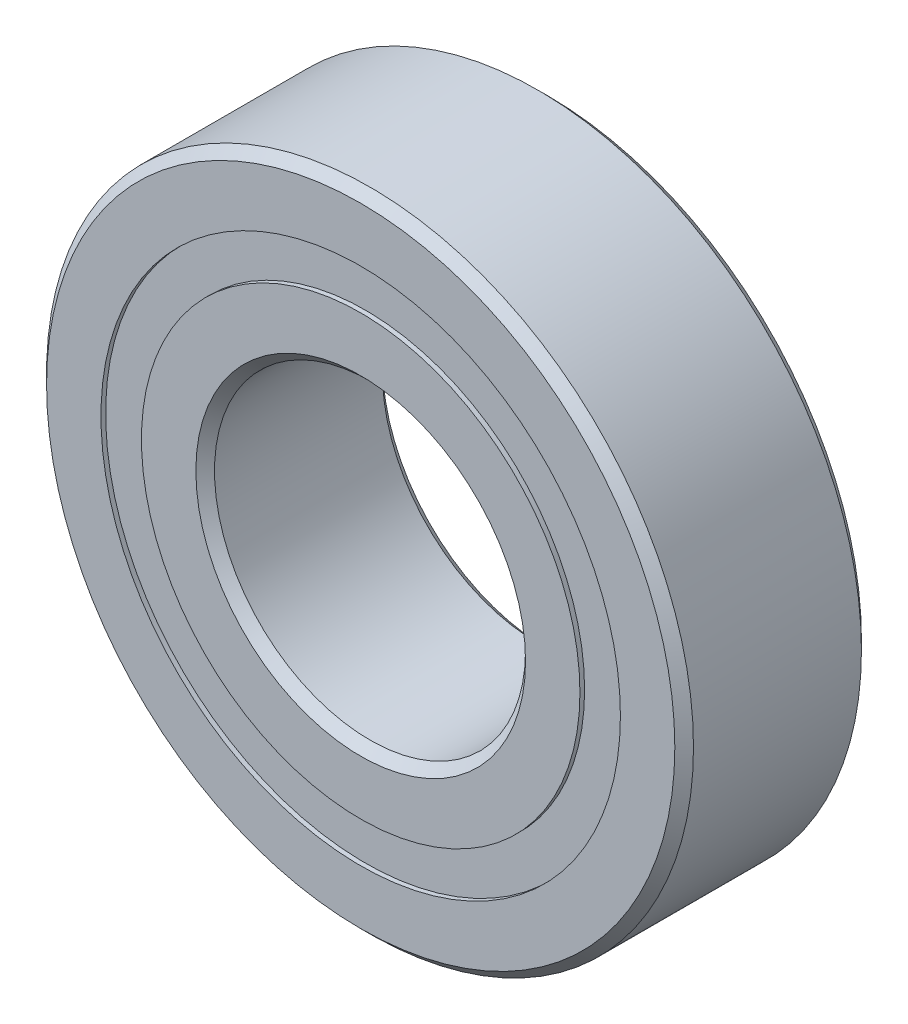
ISO-10303-21;
HEADER;
FILE_DESCRIPTION(('STEP AP214'),'2;1');
FILE_NAME('part.step','',(''),(''),'','','');
FILE_SCHEMA(('AUTOMOTIVE_DESIGN { 1 0 10303 214 1 1 1 1 }'));
ENDSEC;
DATA;
#1=APPLICATION_CONTEXT('core data for automotive mechanical design processes');
#2=APPLICATION_PROTOCOL_DEFINITION('international standard','automotive_design',2000,#1);
#3=PRODUCT_CONTEXT('',#1,'mechanical');
#4=PRODUCT('Part','Part','',(#3));
#5=PRODUCT_RELATED_PRODUCT_CATEGORY('part','',(#4));
#6=PRODUCT_DEFINITION_FORMATION('','',#4);
#7=PRODUCT_DEFINITION_CONTEXT('part definition',#1,'design');
#8=PRODUCT_DEFINITION('design','',#6,#7);
#9=PRODUCT_DEFINITION_SHAPE('','',#8);
#10=(LENGTH_UNIT() NAMED_UNIT(*) SI_UNIT(.MILLI.,.METRE.));
#11=(NAMED_UNIT(*) PLANE_ANGLE_UNIT() SI_UNIT($,.RADIAN.));
#12=(NAMED_UNIT(*) SI_UNIT($,.STERADIAN.) SOLID_ANGLE_UNIT());
#13=UNCERTAINTY_MEASURE_WITH_UNIT(LENGTH_MEASURE(1.E-05),#10,'distance_accuracy_value','');
#14=(GEOMETRIC_REPRESENTATION_CONTEXT(3) GLOBAL_UNCERTAINTY_ASSIGNED_CONTEXT((#13)) GLOBAL_UNIT_ASSIGNED_CONTEXT((#10,
#11,#12)) REPRESENTATION_CONTEXT('',''));
#15=CARTESIAN_POINT('',(0.,0.,0.));
#16=DIRECTION('',(0.,0.,1.));
#17=DIRECTION('',(1.,0.,0.));
#18=AXIS2_PLACEMENT_3D('',#15,#16,#17);
#19=CARTESIAN_POINT('',(0.,20.8763736263736,-7.12500000000001));
#20=DIRECTION('',(0.,0.,1.));
#21=DIRECTION('',(1.,0.,0.));
#22=AXIS2_PLACEMENT_3D('',#19,#20,#21);
#23=PLANE('',#22);
#24=CARTESIAN_POINT('',(0.,0.,-7.12500000000001));
#25=DIRECTION('',(0.,0.,1.));
#26=DIRECTION('',(1.,0.,0.));
#27=AXIS2_PLACEMENT_3D('',#24,#25,#26);
#28=CIRCLE('',#27,20.8763736263736);
#29=CARTESIAN_POINT('',(20.8763736263736,0.,-7.12500000000001));
#30=VERTEX_POINT('',#29);
#31=EDGE_CURVE('E55',#30,#30,#28,.T.);
#32=ORIENTED_EDGE('',*,*,#31,.F.);
#33=EDGE_LOOP('',(#32));
#34=FACE_BOUND('',#33,.T.);
#35=CARTESIAN_POINT('',(0.,0.,-7.12500000000001));
#36=DIRECTION('',(0.,0.,1.));
#37=DIRECTION('',(1.,0.,0.));
#38=AXIS2_PLACEMENT_3D('',#35,#36,#37);
#39=CIRCLE('',#38,17.6236263736264);
#40=CARTESIAN_POINT('',(17.6236263736264,0.,-7.12500000000001));
#41=VERTEX_POINT('',#40);
#42=EDGE_CURVE('E11',#41,#41,#39,.T.);
#43=ORIENTED_EDGE('',*,*,#42,.T.);
#44=EDGE_LOOP('',(#43));
#45=FACE_BOUND('',#44,.T.);
#46=ADVANCED_FACE('F41',(#34,#45),#23,.F.);
#47=CARTESIAN_POINT('',(0.,0.,7.5));
#48=DIRECTION('',(0.,0.,1.));
#49=DIRECTION('',(1.,0.,0.));
#50=AXIS2_PLACEMENT_3D('',#47,#48,#49);
#51=CYLINDRICAL_SURFACE('',#50,17.6236263736264);
#52=ORIENTED_EDGE('',*,*,#42,.F.);
#53=EDGE_LOOP('',(#52));
#54=FACE_BOUND('',#53,.T.);
#55=CARTESIAN_POINT('',(0.,0.,-3.70893546501888));
#56=DIRECTION('',(0.,0.,1.));
#57=DIRECTION('',(1.,0.,0.));
#58=AXIS2_PLACEMENT_3D('',#55,#56,#57);
#59=CIRCLE('',#58,17.6236263736264);
#60=CARTESIAN_POINT('',(17.6236263736264,0.,-3.70893546501888));
#61=VERTEX_POINT('',#60);
#62=EDGE_CURVE('E47',#61,#61,#59,.T.);
#63=ORIENTED_EDGE('',*,*,#62,.T.);
#64=EDGE_LOOP('',(#63));
#65=FACE_BOUND('',#64,.T.);
#66=ADVANCED_FACE('F64',(#54,#65),#51,.F.);
#67=CARTESIAN_POINT('',(0.,20.8763736263736,-3.70893546501888));
#68=DIRECTION('',(0.,0.,-1.));
#69=DIRECTION('',(-1.,0.,0.));
#70=AXIS2_PLACEMENT_3D('',#67,#68,#69);
#71=PLANE('',#70);
#72=ORIENTED_EDGE('',*,*,#62,.F.);
#73=EDGE_LOOP('',(#72));
#74=FACE_BOUND('',#73,.T.);
#75=CARTESIAN_POINT('',(0.,0.,-3.70893546501888));
#76=DIRECTION('',(0.,0.,1.));
#77=DIRECTION('',(1.,0.,0.));
#78=AXIS2_PLACEMENT_3D('',#75,#76,#77);
#79=CIRCLE('',#78,20.8763736263736);
#80=CARTESIAN_POINT('',(20.8763736263736,0.,-3.70893546501888));
#81=VERTEX_POINT('',#80);
#82=EDGE_CURVE('E51',#81,#81,#79,.T.);
#83=ORIENTED_EDGE('',*,*,#82,.T.);
#84=EDGE_LOOP('',(#83));
#85=FACE_BOUND('',#84,.T.);
#86=ADVANCED_FACE('F68',(#74,#85),#71,.F.);
#87=CARTESIAN_POINT('',(0.,0.,7.5));
#88=DIRECTION('',(0.,0.,1.));
#89=DIRECTION('',(1.,0.,0.));
#90=AXIS2_PLACEMENT_3D('',#87,#88,#89);
#91=CYLINDRICAL_SURFACE('',#90,20.8763736263736);
#92=ORIENTED_EDGE('',*,*,#82,.F.);
#93=EDGE_LOOP('',(#92));
#94=FACE_BOUND('',#93,.T.);
#95=ORIENTED_EDGE('',*,*,#31,.T.);
#96=EDGE_LOOP('',(#95));
#97=FACE_BOUND('',#96,.T.);
#98=ADVANCED_FACE('F61',(#94,#97),#91,.T.);
#99=CLOSED_SHELL('',(#46,#66,#86,#98));
#100=MANIFOLD_SOLID_BREP('B2',#99);
#101=CARTESIAN_POINT('',(0.,20.8763736263736,7.125));
#102=DIRECTION('',(0.,0.,-1.));
#103=DIRECTION('',(-1.,0.,0.));
#104=AXIS2_PLACEMENT_3D('',#101,#102,#103);
#105=PLANE('',#104);
#106=CARTESIAN_POINT('',(0.,0.,7.125));
#107=DIRECTION('',(0.,0.,1.));
#108=DIRECTION('',(1.,0.,0.));
#109=AXIS2_PLACEMENT_3D('',#106,#107,#108);
#110=CIRCLE('',#109,17.6236263736264);
#111=CARTESIAN_POINT('',(17.6236263736264,0.,7.125));
#112=VERTEX_POINT('',#111);
#113=EDGE_CURVE('E40',#112,#112,#110,.T.);
#114=ORIENTED_EDGE('',*,*,#113,.F.);
#115=EDGE_LOOP('',(#114));
#116=FACE_BOUND('',#115,.T.);
#117=CARTESIAN_POINT('',(0.,0.,7.125));
#118=DIRECTION('',(0.,0.,1.));
#119=DIRECTION('',(1.,0.,0.));
#120=AXIS2_PLACEMENT_3D('',#117,#118,#119);
#121=CIRCLE('',#120,20.8763736263736);
#122=CARTESIAN_POINT('',(20.8763736263736,0.,7.125));
#123=VERTEX_POINT('',#122);
#124=EDGE_CURVE('E122',#123,#123,#121,.T.);
#125=ORIENTED_EDGE('',*,*,#124,.T.);
#126=EDGE_LOOP('',(#125));
#127=FACE_BOUND('',#126,.T.);
#128=ADVANCED_FACE('F108',(#116,#127),#105,.F.);
#129=CARTESIAN_POINT('',(0.,0.,7.5));
#130=DIRECTION('',(0.,0.,1.));
#131=DIRECTION('',(1.,0.,0.));
#132=AXIS2_PLACEMENT_3D('',#129,#130,#131);
#133=CYLINDRICAL_SURFACE('',#132,17.6236263736264);
#134=CARTESIAN_POINT('',(0.,0.,3.70893546501888));
#135=DIRECTION('',(0.,0.,1.));
#136=DIRECTION('',(1.,0.,0.));
#137=AXIS2_PLACEMENT_3D('',#134,#135,#136);
#138=CIRCLE('',#137,17.6236263736264);
#139=CARTESIAN_POINT('',(17.6236263736264,0.,3.70893546501888));
#140=VERTEX_POINT('',#139);
#141=EDGE_CURVE('E114',#140,#140,#138,.T.);
#142=ORIENTED_EDGE('',*,*,#141,.F.);
#143=EDGE_LOOP('',(#142));
#144=FACE_BOUND('',#143,.T.);
#145=ORIENTED_EDGE('',*,*,#113,.T.);
#146=EDGE_LOOP('',(#145));
#147=FACE_BOUND('',#146,.T.);
#148=ADVANCED_FACE('F137',(#144,#147),#133,.F.);
#149=CARTESIAN_POINT('',(0.,20.8763736263736,3.70893546501888));
#150=DIRECTION('',(0.,0.,1.));
#151=DIRECTION('',(1.,0.,0.));
#152=AXIS2_PLACEMENT_3D('',#149,#150,#151);
#153=PLANE('',#152);
#154=CARTESIAN_POINT('',(0.,0.,3.70893546501888));
#155=DIRECTION('',(0.,0.,1.));
#156=DIRECTION('',(1.,0.,0.));
#157=AXIS2_PLACEMENT_3D('',#154,#155,#156);
#158=CIRCLE('',#157,20.8763736263736);
#159=CARTESIAN_POINT('',(20.8763736263736,0.,3.70893546501888));
#160=VERTEX_POINT('',#159);
#161=EDGE_CURVE('E118',#160,#160,#158,.T.);
#162=ORIENTED_EDGE('',*,*,#161,.F.);
#163=EDGE_LOOP('',(#162));
#164=FACE_BOUND('',#163,.T.);
#165=ORIENTED_EDGE('',*,*,#141,.T.);
#166=EDGE_LOOP('',(#165));
#167=FACE_BOUND('',#166,.T.);
#168=ADVANCED_FACE('F132',(#164,#167),#153,.F.);
#169=CARTESIAN_POINT('',(0.,0.,7.5));
#170=DIRECTION('',(0.,0.,1.));
#171=DIRECTION('',(1.,0.,0.));
#172=AXIS2_PLACEMENT_3D('',#169,#170,#171);
#173=CYLINDRICAL_SURFACE('',#172,20.8763736263736);
#174=ORIENTED_EDGE('',*,*,#124,.F.);
#175=EDGE_LOOP('',(#174));
#176=FACE_BOUND('',#175,.T.);
#177=ORIENTED_EDGE('',*,*,#161,.T.);
#178=EDGE_LOOP('',(#177));
#179=FACE_BOUND('',#178,.T.);
#180=ADVANCED_FACE('F129',(#176,#179),#173,.T.);
#181=CLOSED_SHELL('',(#128,#148,#168,#180));
#182=MANIFOLD_SOLID_BREP('B6',#181);
#183=CARTESIAN_POINT('',(-9.62499999999979,16.6709890228506,0.));
#184=DIRECTION('',(0.,0.,1.));
#185=DIRECTION('',(-0.499999999999989,0.866025403784445,0.));
#186=AXIS2_PLACEMENT_3D('',#183,#184,#185);
#187=SPHERICAL_SURFACE('',#186,3.70893546501888);
#188=CARTESIAN_POINT('',(-9.62499999999979,16.6709890228506,3.70893546501888));
#189=VERTEX_POINT('',#188);
#190=VERTEX_LOOP('',#189);
#191=FACE_BOUND('',#190,.T.);
#192=ADVANCED_FACE('F175',(#191),#187,.T.);
#193=CLOSED_SHELL('',(#192));
#194=MANIFOLD_SOLID_BREP('B35',#193);
#195=CARTESIAN_POINT('',(-16.6709890228503,9.62500000000019,0.));
#196=DIRECTION('',(0.,0.,1.));
#197=DIRECTION('',(-0.866025403784433,0.50000000000001,0.));
#198=AXIS2_PLACEMENT_3D('',#195,#196,#197);
#199=SPHERICAL_SURFACE('',#198,3.70893546501888);
#200=CARTESIAN_POINT('',(-16.6709890228503,9.62500000000019,3.70893546501888));
#201=VERTEX_POINT('',#200);
#202=VERTEX_LOOP('',#201);
#203=FACE_BOUND('',#202,.T.);
#204=ADVANCED_FACE('F195',(#203),#199,.T.);
#205=CLOSED_SHELL('',(#204));
#206=MANIFOLD_SOLID_BREP('B104',#205);
#207=CARTESIAN_POINT('',(-19.25,2.01633047318191E-13,0.));
#208=DIRECTION('',(0.,0.,1.));
#209=DIRECTION('',(-1.,0.,0.));
#210=AXIS2_PLACEMENT_3D('',#207,#208,#209);
#211=SPHERICAL_SURFACE('',#210,3.70893546501888);
#212=CARTESIAN_POINT('',(-19.25,2.01633047318191E-13,3.70893546501888));
#213=VERTEX_POINT('',#212);
#214=VERTEX_LOOP('',#213);
#215=FACE_BOUND('',#214,.T.);
#216=ADVANCED_FACE('F215',(#215),#211,.T.);
#217=CLOSED_SHELL('',(#216));
#218=MANIFOLD_SOLID_BREP('B171',#217);
#219=CARTESIAN_POINT('',(-16.6709890228505,-9.62499999999985,0.));
#220=DIRECTION('',(0.,0.,1.));
#221=DIRECTION('',(-0.866025403784443,-0.499999999999992,0.));
#222=AXIS2_PLACEMENT_3D('',#219,#220,#221);
#223=SPHERICAL_SURFACE('',#222,3.70893546501888);
#224=CARTESIAN_POINT('',(-16.6709890228505,-9.62499999999985,3.70893546501888));
#225=VERTEX_POINT('',#224);
#226=VERTEX_LOOP('',#225);
#227=FACE_BOUND('',#226,.T.);
#228=ADVANCED_FACE('F235',(#227),#223,.T.);
#229=CLOSED_SHELL('',(#228));
#230=MANIFOLD_SOLID_BREP('B191',#229);
#231=CARTESIAN_POINT('',(-9.62500000000014,-16.6709890228504,0.));
#232=DIRECTION('',(0.,0.,1.));
#233=DIRECTION('',(-0.500000000000007,-0.866025403784435,0.));
#234=AXIS2_PLACEMENT_3D('',#231,#232,#233);
#235=SPHERICAL_SURFACE('',#234,3.70893546501888);
#236=CARTESIAN_POINT('',(-9.62500000000014,-16.6709890228504,3.70893546501888));
#237=VERTEX_POINT('',#236);
#238=VERTEX_LOOP('',#237);
#239=FACE_BOUND('',#238,.T.);
#240=ADVANCED_FACE('F255',(#239),#235,.T.);
#241=CLOSED_SHELL('',(#240));
#242=MANIFOLD_SOLID_BREP('B211',#241);
#243=CARTESIAN_POINT('',(-1.34422031545461E-13,-19.25,0.));
#244=DIRECTION('',(0.,0.,1.));
#245=DIRECTION('',(0.,-1.,0.));
#246=AXIS2_PLACEMENT_3D('',#243,#244,#245);
#247=SPHERICAL_SURFACE('',#246,3.70893546501888);
#248=CARTESIAN_POINT('',(-1.34422031545461E-13,-19.25,3.70893546501888));
#249=VERTEX_POINT('',#248);
#250=VERTEX_LOOP('',#249);
#251=FACE_BOUND('',#250,.T.);
#252=ADVANCED_FACE('F275',(#251),#247,.T.);
#253=CLOSED_SHELL('',(#252));
#254=MANIFOLD_SOLID_BREP('B231',#253);
#255=CARTESIAN_POINT('',(9.6249999999999,-16.6709890228505,0.));
#256=DIRECTION('',(0.,0.,1.));
#257=DIRECTION('',(0.499999999999995,-0.866025403784442,0.));
#258=AXIS2_PLACEMENT_3D('',#255,#256,#257);
#259=SPHERICAL_SURFACE('',#258,3.70893546501888);
#260=CARTESIAN_POINT('',(9.6249999999999,-16.6709890228505,3.70893546501888));
#261=VERTEX_POINT('',#260);
#262=VERTEX_LOOP('',#261);
#263=FACE_BOUND('',#262,.T.);
#264=ADVANCED_FACE('F295',(#263),#259,.T.);
#265=CLOSED_SHELL('',(#264));
#266=MANIFOLD_SOLID_BREP('B251',#265);
#267=CARTESIAN_POINT('',(16.6709890228504,-9.62500000000008,0.));
#268=DIRECTION('',(0.,0.,1.));
#269=DIRECTION('',(0.866025403784436,-0.500000000000004,0.));
#270=AXIS2_PLACEMENT_3D('',#267,#268,#269);
#271=SPHERICAL_SURFACE('',#270,3.70893546501888);
#272=CARTESIAN_POINT('',(16.6709890228504,-9.62500000000008,3.70893546501888));
#273=VERTEX_POINT('',#272);
#274=VERTEX_LOOP('',#273);
#275=FACE_BOUND('',#274,.T.);
#276=ADVANCED_FACE('F315',(#275),#271,.T.);
#277=CLOSED_SHELL('',(#276));
#278=MANIFOLD_SOLID_BREP('B271',#277);
#279=CARTESIAN_POINT('',(19.25,0.,0.));
#280=DIRECTION('',(0.,0.,1.));
#281=DIRECTION('',(1.,0.,0.));
#282=AXIS2_PLACEMENT_3D('',#279,#280,#281);
#283=SPHERICAL_SURFACE('',#282,3.70893546501888);
#284=CARTESIAN_POINT('',(19.25,0.,3.70893546501888));
#285=VERTEX_POINT('',#284);
#286=VERTEX_LOOP('',#285);
#287=FACE_BOUND('',#286,.T.);
#288=ADVANCED_FACE('F335',(#287),#283,.T.);
#289=CLOSED_SHELL('',(#288));
#290=MANIFOLD_SOLID_BREP('B291',#289);
#291=CARTESIAN_POINT('',(16.6709890228505,9.62499999999996,0.));
#292=DIRECTION('',(0.,0.,1.));
#293=DIRECTION('',(0.86602540378444,0.499999999999998,0.));
#294=AXIS2_PLACEMENT_3D('',#291,#292,#293);
#295=SPHERICAL_SURFACE('',#294,3.70893546501888);
#296=CARTESIAN_POINT('',(16.6709890228505,9.62499999999996,3.70893546501888));
#297=VERTEX_POINT('',#296);
#298=VERTEX_LOOP('',#297);
#299=FACE_BOUND('',#298,.T.);
#300=ADVANCED_FACE('F355',(#299),#295,.T.);
#301=CLOSED_SHELL('',(#300));
#302=MANIFOLD_SOLID_BREP('B311',#301);
#303=CARTESIAN_POINT('',(9.62500000000002,16.6709890228504,0.));
#304=DIRECTION('',(0.,0.,1.));
#305=DIRECTION('',(0.500000000000001,0.866025403784438,0.));
#306=AXIS2_PLACEMENT_3D('',#303,#304,#305);
#307=SPHERICAL_SURFACE('',#306,3.70893546501888);
#308=CARTESIAN_POINT('',(9.62500000000002,16.6709890228504,3.70893546501888));
#309=VERTEX_POINT('',#308);
#310=VERTEX_LOOP('',#309);
#311=FACE_BOUND('',#310,.T.);
#312=ADVANCED_FACE('F375',(#311),#307,.T.);
#313=CLOSED_SHELL('',(#312));
#314=MANIFOLD_SOLID_BREP('B331',#313);
#315=CARTESIAN_POINT('',(0.,19.25,0.));
#316=DIRECTION('',(0.,0.,1.));
#317=DIRECTION('',(0.,1.,0.));
#318=AXIS2_PLACEMENT_3D('',#315,#316,#317);
#319=SPHERICAL_SURFACE('',#318,3.70893546501888);
#320=CARTESIAN_POINT('',(0.,19.25,3.70893546501888));
#321=VERTEX_POINT('',#320);
#322=VERTEX_LOOP('',#321);
#323=FACE_BOUND('',#322,.T.);
#324=ADVANCED_FACE('F397',(#323),#319,.T.);
#325=CLOSED_SHELL('',(#324));
#326=MANIFOLD_SOLID_BREP('B351',#325);
#327=CARTESIAN_POINT('',(0.,17.6236263736264,7.50000000000001));
#328=DIRECTION('',(0.,0.,-1.));
#329=DIRECTION('',(-1.,0.,0.));
#330=AXIS2_PLACEMENT_3D('',#327,#328,#329);
#331=PLANE('',#330);
#332=CARTESIAN_POINT('',(0.,0.,7.5));
#333=DIRECTION('',(0.,0.,1.));
#334=DIRECTION('',(1.,0.,0.));
#335=AXIS2_PLACEMENT_3D('',#332,#333,#334);
#336=CIRCLE('',#335,13.25);
#337=CARTESIAN_POINT('',(13.25,0.,7.5));
#338=VERTEX_POINT('',#337);
#339=EDGE_CURVE('E444',#338,#338,#336,.T.);
#340=ORIENTED_EDGE('',*,*,#339,.F.);
#341=EDGE_LOOP('',(#340));
#342=FACE_BOUND('',#341,.T.);
#343=CARTESIAN_POINT('',(0.,0.,7.50000000000001));
#344=DIRECTION('',(0.,0.,1.));
#345=DIRECTION('',(1.,0.,0.));
#346=AXIS2_PLACEMENT_3D('',#343,#344,#345);
#347=CIRCLE('',#346,17.6236263736264);
#348=CARTESIAN_POINT('',(17.6236263736264,0.,7.50000000000001));
#349=VERTEX_POINT('',#348);
#350=EDGE_CURVE('E396',#349,#349,#347,.T.);
#351=ORIENTED_EDGE('',*,*,#350,.T.);
#352=EDGE_LOOP('',(#351));
#353=FACE_BOUND('',#352,.T.);
#354=ADVANCED_FACE('F416',(#342,#353),#331,.F.);
#355=CARTESIAN_POINT('',(0.,0.,7.5));
#356=DIRECTION('',(0.,0.,1.));
#357=DIRECTION('',(1.,0.,0.));
#358=AXIS2_PLACEMENT_3D('',#355,#356,#357);
#359=CYLINDRICAL_SURFACE('',#358,17.6236263736264);
#360=ORIENTED_EDGE('',*,*,#350,.F.);
#361=EDGE_LOOP('',(#360));
#362=FACE_BOUND('',#361,.T.);
#363=CARTESIAN_POINT('',(0.,0.,3.33333333333333));
#364=DIRECTION('',(0.,0.,1.));
#365=DIRECTION('',(1.,0.,0.));
#366=AXIS2_PLACEMENT_3D('',#363,#364,#365);
#367=CIRCLE('',#366,17.6236263736264);
#368=CARTESIAN_POINT('',(17.6236263736264,0.,3.33333333333333));
#369=VERTEX_POINT('',#368);
#370=EDGE_CURVE('E422',#369,#369,#367,.T.);
#371=ORIENTED_EDGE('',*,*,#370,.T.);
#372=EDGE_LOOP('',(#371));
#373=FACE_BOUND('',#372,.T.);
#374=ADVANCED_FACE('F451',(#362,#373),#359,.T.);
#375=CARTESIAN_POINT('',(0.,0.,0.));
#376=DIRECTION('',(0.,0.,1.));
#377=DIRECTION('',(1.,0.,0.));
#378=AXIS2_PLACEMENT_3D('',#375,#376,#377);
#379=TOROIDAL_SURFACE('',#378,19.25,3.70893546501887);
#380=ORIENTED_EDGE('',*,*,#370,.F.);
#381=EDGE_LOOP('',(#380));
#382=FACE_BOUND('',#381,.T.);
#383=CARTESIAN_POINT('',(0.,0.,-3.33333333333334));
#384=DIRECTION('',(0.,0.,1.));
#385=DIRECTION('',(1.,0.,0.));
#386=AXIS2_PLACEMENT_3D('',#383,#384,#385);
#387=CIRCLE('',#386,17.6236263736264);
#388=CARTESIAN_POINT('',(17.6236263736264,0.,-3.33333333333334));
#389=VERTEX_POINT('',#388);
#390=EDGE_CURVE('E426',#389,#389,#387,.T.);
#391=ORIENTED_EDGE('',*,*,#390,.T.);
#392=EDGE_LOOP('',(#391));
#393=FACE_BOUND('',#392,.T.);
#394=ADVANCED_FACE('F455',(#382,#393),#379,.F.);
#395=CARTESIAN_POINT('',(0.,0.,7.5));
#396=DIRECTION('',(0.,0.,1.));
#397=DIRECTION('',(1.,0.,0.));
#398=AXIS2_PLACEMENT_3D('',#395,#396,#397);
#399=CYLINDRICAL_SURFACE('',#398,17.6236263736264);
#400=ORIENTED_EDGE('',*,*,#390,.F.);
#401=EDGE_LOOP('',(#400));
#402=FACE_BOUND('',#401,.T.);
#403=CARTESIAN_POINT('',(0.,0.,-7.50000000000001));
#404=DIRECTION('',(0.,0.,1.));
#405=DIRECTION('',(1.,0.,0.));
#406=AXIS2_PLACEMENT_3D('',#403,#404,#405);
#407=CIRCLE('',#406,17.6236263736264);
#408=CARTESIAN_POINT('',(17.6236263736264,0.,-7.50000000000001));
#409=VERTEX_POINT('',#408);
#410=EDGE_CURVE('E430',#409,#409,#407,.T.);
#411=ORIENTED_EDGE('',*,*,#410,.T.);
#412=EDGE_LOOP('',(#411));
#413=FACE_BOUND('',#412,.T.);
#414=ADVANCED_FACE('F460',(#402,#413),#399,.T.);
#415=CARTESIAN_POINT('',(0.,13.25,-7.50000000000001));
#416=DIRECTION('',(0.,0.,1.));
#417=DIRECTION('',(1.,0.,0.));
#418=AXIS2_PLACEMENT_3D('',#415,#416,#417);
#419=PLANE('',#418);
#420=ORIENTED_EDGE('',*,*,#410,.F.);
#421=EDGE_LOOP('',(#420));
#422=FACE_BOUND('',#421,.T.);
#423=CARTESIAN_POINT('',(0.,0.,-7.50000000000001));
#424=DIRECTION('',(0.,0.,1.));
#425=DIRECTION('',(1.,0.,0.));
#426=AXIS2_PLACEMENT_3D('',#423,#424,#425);
#427=CIRCLE('',#426,13.25);
#428=CARTESIAN_POINT('',(13.25,0.,-7.50000000000001));
#429=VERTEX_POINT('',#428);
#430=EDGE_CURVE('E435',#429,#429,#427,.T.);
#431=ORIENTED_EDGE('',*,*,#430,.T.);
#432=EDGE_LOOP('',(#431));
#433=FACE_BOUND('',#432,.T.);
#434=ADVANCED_FACE('F466',(#422,#433),#419,.F.);
#435=CARTESIAN_POINT('',(0.,0.,-6.75000000000001));
#436=DIRECTION('',(0.,0.,-1.));
#437=DIRECTION('',(-1.,0.,0.));
#438=AXIS2_PLACEMENT_3D('',#435,#436,#437);
#439=CONICAL_SURFACE('',#438,12.5,0.785398163397444);
#440=ORIENTED_EDGE('',*,*,#430,.F.);
#441=EDGE_LOOP('',(#440));
#442=FACE_BOUND('',#441,.T.);
#443=CARTESIAN_POINT('',(0.,0.,-6.75000000000001));
#444=DIRECTION('',(0.,0.,1.));
#445=DIRECTION('',(1.,0.,0.));
#446=AXIS2_PLACEMENT_3D('',#443,#444,#445);
#447=CIRCLE('',#446,12.5);
#448=CARTESIAN_POINT('',(12.5,0.,-6.75000000000001));
#449=VERTEX_POINT('',#448);
#450=EDGE_CURVE('E438',#449,#449,#447,.T.);
#451=ORIENTED_EDGE('',*,*,#450,.T.);
#452=EDGE_LOOP('',(#451));
#453=FACE_BOUND('',#452,.T.);
#454=ADVANCED_FACE('F470',(#442,#453),#439,.F.);
#455=CARTESIAN_POINT('',(0.,0.,7.5));
#456=DIRECTION('',(0.,0.,1.));
#457=DIRECTION('',(1.,0.,0.));
#458=AXIS2_PLACEMENT_3D('',#455,#456,#457);
#459=CYLINDRICAL_SURFACE('',#458,12.5);
#460=ORIENTED_EDGE('',*,*,#450,.F.);
#461=EDGE_LOOP('',(#460));
#462=FACE_BOUND('',#461,.T.);
#463=CARTESIAN_POINT('',(0.,0.,6.75000000000001));
#464=DIRECTION('',(0.,0.,1.));
#465=DIRECTION('',(1.,0.,0.));
#466=AXIS2_PLACEMENT_3D('',#463,#464,#465);
#467=CIRCLE('',#466,12.5);
#468=CARTESIAN_POINT('',(12.5,0.,6.75000000000001));
#469=VERTEX_POINT('',#468);
#470=EDGE_CURVE('E441',#469,#469,#467,.T.);
#471=ORIENTED_EDGE('',*,*,#470,.T.);
#472=EDGE_LOOP('',(#471));
#473=FACE_BOUND('',#472,.T.);
#474=ADVANCED_FACE('F474',(#462,#473),#459,.F.);
#475=CARTESIAN_POINT('',(0.,0.,7.5));
#476=DIRECTION('',(0.,0.,1.));
#477=DIRECTION('',(1.,0.,0.));
#478=AXIS2_PLACEMENT_3D('',#475,#476,#477);
#479=CONICAL_SURFACE('',#478,13.25,0.785398163397455);
#480=ORIENTED_EDGE('',*,*,#470,.F.);
#481=EDGE_LOOP('',(#480));
#482=FACE_BOUND('',#481,.T.);
#483=ORIENTED_EDGE('',*,*,#339,.T.);
#484=EDGE_LOOP('',(#483));
#485=FACE_BOUND('',#484,.T.);
#486=ADVANCED_FACE('F448',(#482,#485),#479,.F.);
#487=CLOSED_SHELL('',(#354,#374,#394,#414,#434,#454,#474,#486));
#488=MANIFOLD_SOLID_BREP('B371',#487);
#489=CARTESIAN_POINT('',(0.,0.,6.75));
#490=DIRECTION('',(0.,0.,-1.));
#491=DIRECTION('',(-1.,0.,0.));
#492=AXIS2_PLACEMENT_3D('',#489,#490,#491);
#493=CONICAL_SURFACE('',#492,26.,0.785398163397447);
#494=CARTESIAN_POINT('',(0.,0.,7.5));
#495=DIRECTION('',(0.,0.,1.));
#496=DIRECTION('',(1.,0.,0.));
#497=AXIS2_PLACEMENT_3D('',#494,#495,#496);
#498=CIRCLE('',#497,25.25);
#499=CARTESIAN_POINT('',(25.25,0.,7.5));
#500=VERTEX_POINT('',#499);
#501=EDGE_CURVE('E565',#500,#500,#498,.T.);
#502=ORIENTED_EDGE('',*,*,#501,.F.);
#503=EDGE_LOOP('',(#502));
#504=FACE_BOUND('',#503,.T.);
#505=CARTESIAN_POINT('',(0.,0.,6.75));
#506=DIRECTION('',(0.,0.,1.));
#507=DIRECTION('',(1.,0.,0.));
#508=AXIS2_PLACEMENT_3D('',#505,#506,#507);
#509=CIRCLE('',#508,26.);
#510=CARTESIAN_POINT('',(26.,0.,6.75));
#511=VERTEX_POINT('',#510);
#512=EDGE_CURVE('E415',#511,#511,#509,.T.);
#513=ORIENTED_EDGE('',*,*,#512,.T.);
#514=EDGE_LOOP('',(#513));
#515=FACE_BOUND('',#514,.T.);
#516=ADVANCED_FACE('F537',(#504,#515),#493,.T.);
#517=CARTESIAN_POINT('',(0.,0.,7.5));
#518=DIRECTION('',(0.,0.,1.));
#519=DIRECTION('',(1.,0.,0.));
#520=AXIS2_PLACEMENT_3D('',#517,#518,#519);
#521=CYLINDRICAL_SURFACE('',#520,26.);
#522=ORIENTED_EDGE('',*,*,#512,.F.);
#523=EDGE_LOOP('',(#522));
#524=FACE_BOUND('',#523,.T.);
#525=CARTESIAN_POINT('',(0.,0.,-6.75));
#526=DIRECTION('',(0.,0.,1.));
#527=DIRECTION('',(1.,0.,0.));
#528=AXIS2_PLACEMENT_3D('',#525,#526,#527);
#529=CIRCLE('',#528,26.);
#530=CARTESIAN_POINT('',(26.,0.,-6.75));
#531=VERTEX_POINT('',#530);
#532=EDGE_CURVE('E543',#531,#531,#529,.T.);
#533=ORIENTED_EDGE('',*,*,#532,.T.);
#534=EDGE_LOOP('',(#533));
#535=FACE_BOUND('',#534,.T.);
#536=ADVANCED_FACE('F572',(#524,#535),#521,.T.);
#537=CARTESIAN_POINT('',(0.,0.,-7.50000000000001));
#538=DIRECTION('',(0.,0.,1.));
#539=DIRECTION('',(1.,0.,0.));
#540=AXIS2_PLACEMENT_3D('',#537,#538,#539);
#541=CONICAL_SURFACE('',#540,25.25,0.785398163397443);
#542=ORIENTED_EDGE('',*,*,#532,.F.);
#543=EDGE_LOOP('',(#542));
#544=FACE_BOUND('',#543,.T.);
#545=CARTESIAN_POINT('',(0.,0.,-7.50000000000001));
#546=DIRECTION('',(0.,0.,1.));
#547=DIRECTION('',(1.,0.,0.));
#548=AXIS2_PLACEMENT_3D('',#545,#546,#547);
#549=CIRCLE('',#548,25.25);
#550=CARTESIAN_POINT('',(25.25,0.,-7.50000000000001));
#551=VERTEX_POINT('',#550);
#552=EDGE_CURVE('E547',#551,#551,#549,.T.);
#553=ORIENTED_EDGE('',*,*,#552,.T.);
#554=EDGE_LOOP('',(#553));
#555=FACE_BOUND('',#554,.T.);
#556=ADVANCED_FACE('F576',(#544,#555),#541,.T.);
#557=CARTESIAN_POINT('',(0.,25.25,-7.50000000000001));
#558=DIRECTION('',(0.,0.,1.));
#559=DIRECTION('',(1.,0.,0.));
#560=AXIS2_PLACEMENT_3D('',#557,#558,#559);
#561=PLANE('',#560);
#562=ORIENTED_EDGE('',*,*,#552,.F.);
#563=EDGE_LOOP('',(#562));
#564=FACE_BOUND('',#563,.T.);
#565=CARTESIAN_POINT('',(0.,0.,-7.50000000000001));
#566=DIRECTION('',(0.,0.,1.));
#567=DIRECTION('',(1.,0.,0.));
#568=AXIS2_PLACEMENT_3D('',#565,#566,#567);
#569=CIRCLE('',#568,20.8763736263736);
#570=CARTESIAN_POINT('',(20.8763736263736,0.,-7.50000000000001));
#571=VERTEX_POINT('',#570);
#572=EDGE_CURVE('E551',#571,#571,#569,.T.);
#573=ORIENTED_EDGE('',*,*,#572,.T.);
#574=EDGE_LOOP('',(#573));
#575=FACE_BOUND('',#574,.T.);
#576=ADVANCED_FACE('F581',(#564,#575),#561,.F.);
#577=CARTESIAN_POINT('',(0.,0.,7.5));
#578=DIRECTION('',(0.,0.,1.));
#579=DIRECTION('',(1.,0.,0.));
#580=AXIS2_PLACEMENT_3D('',#577,#578,#579);
#581=CYLINDRICAL_SURFACE('',#580,20.8763736263736);
#582=ORIENTED_EDGE('',*,*,#572,.F.);
#583=EDGE_LOOP('',(#582));
#584=FACE_BOUND('',#583,.T.);
#585=CARTESIAN_POINT('',(0.,0.,-3.33333333333334));
#586=DIRECTION('',(0.,0.,1.));
#587=DIRECTION('',(1.,0.,0.));
#588=AXIS2_PLACEMENT_3D('',#585,#586,#587);
#589=CIRCLE('',#588,20.8763736263736);
#590=CARTESIAN_POINT('',(20.8763736263736,0.,-3.33333333333334));
#591=VERTEX_POINT('',#590);
#592=EDGE_CURVE('E556',#591,#591,#589,.T.);
#593=ORIENTED_EDGE('',*,*,#592,.T.);
#594=EDGE_LOOP('',(#593));
#595=FACE_BOUND('',#594,.T.);
#596=ADVANCED_FACE('F587',(#584,#595),#581,.F.);
#597=CARTESIAN_POINT('',(0.,0.,0.));
#598=DIRECTION('',(0.,0.,1.));
#599=DIRECTION('',(1.,0.,0.));
#600=AXIS2_PLACEMENT_3D('',#597,#598,#599);
#601=TOROIDAL_SURFACE('',#600,19.25,3.70893546501888);
#602=ORIENTED_EDGE('',*,*,#592,.F.);
#603=EDGE_LOOP('',(#602));
#604=FACE_BOUND('',#603,.T.);
#605=CARTESIAN_POINT('',(0.,0.,3.33333333333333));
#606=DIRECTION('',(0.,0.,1.));
#607=DIRECTION('',(1.,0.,0.));
#608=AXIS2_PLACEMENT_3D('',#605,#606,#607);
#609=CIRCLE('',#608,20.8763736263736);
#610=CARTESIAN_POINT('',(20.8763736263736,0.,3.33333333333333));
#611=VERTEX_POINT('',#610);
#612=EDGE_CURVE('E559',#611,#611,#609,.T.);
#613=ORIENTED_EDGE('',*,*,#612,.T.);
#614=EDGE_LOOP('',(#613));
#615=FACE_BOUND('',#614,.T.);
#616=ADVANCED_FACE('F591',(#604,#615),#601,.F.);
#617=CARTESIAN_POINT('',(0.,0.,7.5));
#618=DIRECTION('',(0.,0.,1.));
#619=DIRECTION('',(1.,0.,0.));
#620=AXIS2_PLACEMENT_3D('',#617,#618,#619);
#621=CYLINDRICAL_SURFACE('',#620,20.8763736263736);
#622=ORIENTED_EDGE('',*,*,#612,.F.);
#623=EDGE_LOOP('',(#622));
#624=FACE_BOUND('',#623,.T.);
#625=CARTESIAN_POINT('',(0.,0.,7.5));
#626=DIRECTION('',(0.,0.,1.));
#627=DIRECTION('',(1.,0.,0.));
#628=AXIS2_PLACEMENT_3D('',#625,#626,#627);
#629=CIRCLE('',#628,20.8763736263736);
#630=CARTESIAN_POINT('',(20.8763736263736,0.,7.5));
#631=VERTEX_POINT('',#630);
#632=EDGE_CURVE('E562',#631,#631,#629,.T.);
#633=ORIENTED_EDGE('',*,*,#632,.T.);
#634=EDGE_LOOP('',(#633));
#635=FACE_BOUND('',#634,.T.);
#636=ADVANCED_FACE('F595',(#624,#635),#621,.F.);
#637=CARTESIAN_POINT('',(0.,25.25,7.5));
#638=DIRECTION('',(0.,0.,-1.));
#639=DIRECTION('',(-1.,0.,0.));
#640=AXIS2_PLACEMENT_3D('',#637,#638,#639);
#641=PLANE('',#640);
#642=ORIENTED_EDGE('',*,*,#632,.F.);
#643=EDGE_LOOP('',(#642));
#644=FACE_BOUND('',#643,.T.);
#645=ORIENTED_EDGE('',*,*,#501,.T.);
#646=EDGE_LOOP('',(#645));
#647=FACE_BOUND('',#646,.T.);
#648=ADVANCED_FACE('F569',(#644,#647),#641,.F.);
#649=CLOSED_SHELL('',(#516,#536,#556,#576,#596,#616,#636,#648));
#650=MANIFOLD_SOLID_BREP('B391',#649);
#651=ADVANCED_BREP_SHAPE_REPRESENTATION('',(#18,#100,#182,#194,#206,#218,#230,#242,#254,#266,
#278,#290,#302,#314,#326,#488,#650),#14);
#652=SHAPE_DEFINITION_REPRESENTATION(#9,#651);
ENDSEC;
END-ISO-10303-21;
